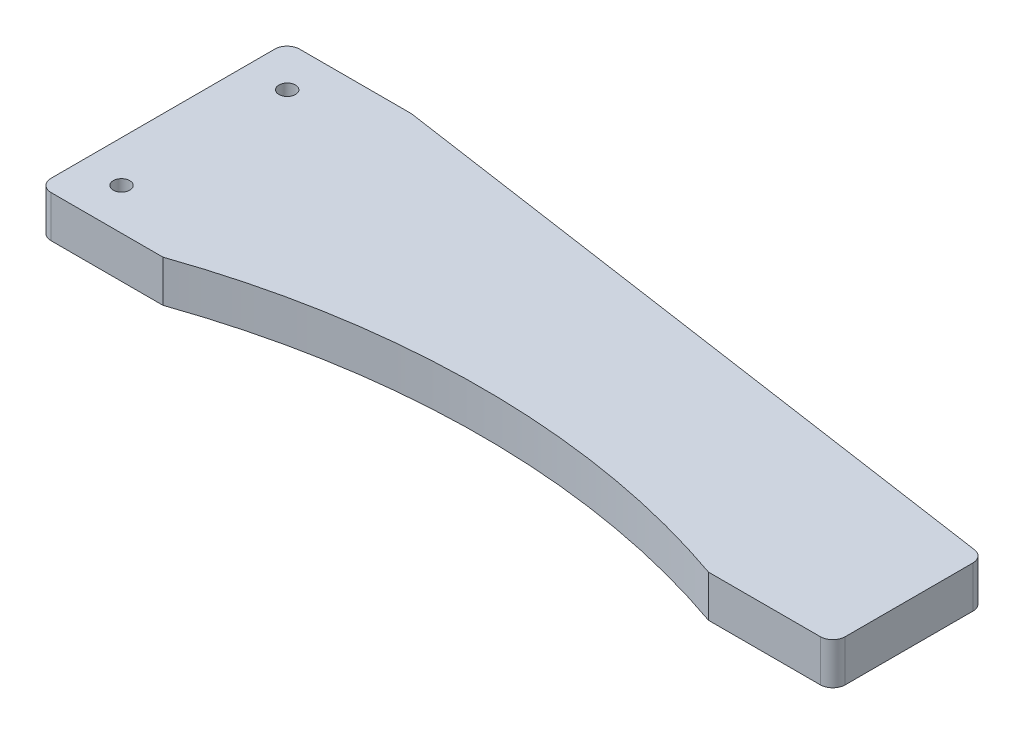
ISO-10303-21;
HEADER;
FILE_DESCRIPTION(('STEP AP214'),'2;1');
FILE_NAME('part.step','',(''),(''),'','','');
FILE_SCHEMA(('AUTOMOTIVE_DESIGN { 1 0 10303 214 1 1 1 1 }'));
ENDSEC;
DATA;
#1=APPLICATION_CONTEXT('core data for automotive mechanical design processes');
#2=APPLICATION_PROTOCOL_DEFINITION('international standard','automotive_design',2000,#1);
#3=PRODUCT_CONTEXT('',#1,'mechanical');
#4=PRODUCT('Part','Part','',(#3));
#5=PRODUCT_RELATED_PRODUCT_CATEGORY('part','',(#4));
#6=PRODUCT_DEFINITION_FORMATION('','',#4);
#7=PRODUCT_DEFINITION_CONTEXT('part definition',#1,'design');
#8=PRODUCT_DEFINITION('design','',#6,#7);
#9=PRODUCT_DEFINITION_SHAPE('','',#8);
#10=(LENGTH_UNIT() NAMED_UNIT(*) SI_UNIT(.MILLI.,.METRE.));
#11=(NAMED_UNIT(*) PLANE_ANGLE_UNIT() SI_UNIT($,.RADIAN.));
#12=(NAMED_UNIT(*) SI_UNIT($,.STERADIAN.) SOLID_ANGLE_UNIT());
#13=UNCERTAINTY_MEASURE_WITH_UNIT(LENGTH_MEASURE(1.E-05),#10,'distance_accuracy_value','');
#14=(GEOMETRIC_REPRESENTATION_CONTEXT(3) GLOBAL_UNCERTAINTY_ASSIGNED_CONTEXT((#13)) GLOBAL_UNIT_ASSIGNED_CONTEXT((#10,
#11,#12)) REPRESENTATION_CONTEXT('',''));
#15=CARTESIAN_POINT('',(0.,0.,0.));
#16=DIRECTION('',(0.,0.,1.));
#17=DIRECTION('',(1.,0.,0.));
#18=AXIS2_PLACEMENT_3D('',#15,#16,#17);
#19=CARTESIAN_POINT('',(0.396442801976787,6.4008,-2.71938751972178));
#20=DIRECTION('',(-0.144258953874828,0.,0.989539971010237));
#21=DIRECTION('',(0.989539971010237,0.,0.144258953874828));
#22=AXIS2_PLACEMENT_3D('',#19,#20,#21);
#23=PLANE('',#22);
#24=DIRECTION('',(-0.989539971010237,0.,-0.144258953874828));
#25=VECTOR('',#24,1.);
#26=CARTESIAN_POINT('',(0.396442801976787,0.,-2.71938751972178));
#27=LINE('',#26,#25);
#28=CARTESIAN_POINT('',(120.124760829426,0.,14.7350685041206));
#29=VERTEX_POINT('',#28);
#30=CARTESIAN_POINT('',(19.1866842365243,0.,0.0199263552255022));
#31=VERTEX_POINT('',#30);
#32=EDGE_CURVE('E160',#29,#31,#27,.T.);
#33=ORIENTED_EDGE('',*,*,#32,.T.);
#34=DIRECTION('',(0.,-1.,0.));
#35=VECTOR('',#34,1.);
#36=CARTESIAN_POINT('',(19.1866842365243,6.4008,0.0199263552255022));
#37=LINE('',#36,#35);
#38=CARTESIAN_POINT('',(19.1866842365243,6.4008,0.0199263552255022));
#39=VERTEX_POINT('',#38);
#40=EDGE_CURVE('E11',#39,#31,#37,.T.);
#41=ORIENTED_EDGE('',*,*,#40,.F.);
#42=DIRECTION('',(-0.989539971010237,0.,-0.144258953874828));
#43=VECTOR('',#42,1.);
#44=CARTESIAN_POINT('',(0.396442801976787,6.4008,-2.71938751972178));
#45=LINE('',#44,#43);
#46=CARTESIAN_POINT('',(120.124760829426,6.4008,14.7350685041206));
#47=VERTEX_POINT('',#46);
#48=EDGE_CURVE('E396',#47,#39,#45,.T.);
#49=ORIENTED_EDGE('',*,*,#48,.F.);
#50=DIRECTION('',(0.,-1.,0.));
#51=VECTOR('',#50,1.);
#52=CARTESIAN_POINT('',(120.124760829426,6.4008,14.7350685041206));
#53=LINE('',#52,#51);
#54=EDGE_CURVE('E150',#47,#29,#53,.T.);
#55=ORIENTED_EDGE('',*,*,#54,.T.);
#56=EDGE_LOOP('',(#33,#41,#49,#55));
#57=FACE_BOUND('',#56,.T.);
#58=ADVANCED_FACE('F32',(#57),#23,.F.);
#59=CARTESIAN_POINT('',(18.9118709293928,6.4008,1.90499999999999));
#60=DIRECTION('',(0.,-1.,0.));
#61=DIRECTION('',(0.,0.,-1.));
#62=AXIS2_PLACEMENT_3D('',#59,#60,#61);
#63=CYLINDRICAL_SURFACE('',#62,1.90499999999999);
#64=CARTESIAN_POINT('',(18.9118709293928,0.,1.90499999999999));
#65=DIRECTION('',(0.,1.,0.));
#66=DIRECTION('',(0.,0.,1.));
#67=AXIS2_PLACEMENT_3D('',#64,#65,#66);
#68=CIRCLE('',#67,1.90499999999999);
#69=CARTESIAN_POINT('',(18.9118709293928,0.,0.));
#70=VERTEX_POINT('',#69);
#71=EDGE_CURVE('E163',#31,#70,#68,.T.);
#72=ORIENTED_EDGE('',*,*,#71,.T.);
#73=DIRECTION('',(0.,-1.,0.));
#74=VECTOR('',#73,1.);
#75=CARTESIAN_POINT('',(18.9118709293928,6.4008,0.));
#76=LINE('',#75,#74);
#77=CARTESIAN_POINT('',(18.9118709293928,6.4008,0.));
#78=VERTEX_POINT('',#77);
#79=EDGE_CURVE('E41',#78,#70,#76,.T.);
#80=ORIENTED_EDGE('',*,*,#79,.F.);
#81=CARTESIAN_POINT('',(18.9118709293928,6.4008,1.90499999999999));
#82=DIRECTION('',(0.,1.,0.));
#83=DIRECTION('',(0.,0.,1.));
#84=AXIS2_PLACEMENT_3D('',#81,#82,#83);
#85=CIRCLE('',#84,1.90499999999999);
#86=EDGE_CURVE('E104',#39,#78,#85,.T.);
#87=ORIENTED_EDGE('',*,*,#86,.F.);
#88=ORIENTED_EDGE('',*,*,#40,.T.);
#89=EDGE_LOOP('',(#72,#80,#87,#88));
#90=FACE_BOUND('',#89,.T.);
#91=ADVANCED_FACE('F258',(#90),#63,.T.);
#92=CARTESIAN_POINT('',(0.,6.4008,0.));
#93=DIRECTION('',(0.,0.,1.));
#94=DIRECTION('',(1.,0.,0.));
#95=AXIS2_PLACEMENT_3D('',#92,#93,#94);
#96=PLANE('',#95);
#97=DIRECTION('',(-1.,0.,0.));
#98=VECTOR('',#97,1.);
#99=CARTESIAN_POINT('',(0.,0.,0.));
#100=LINE('',#99,#98);
#101=CARTESIAN_POINT('',(1.905,0.,0.));
#102=VERTEX_POINT('',#101);
#103=EDGE_CURVE('E165',#70,#102,#100,.T.);
#104=ORIENTED_EDGE('',*,*,#103,.T.);
#105=DIRECTION('',(0.,-1.,0.));
#106=VECTOR('',#105,1.);
#107=CARTESIAN_POINT('',(1.905,6.4008,0.));
#108=LINE('',#107,#106);
#109=CARTESIAN_POINT('',(1.905,6.4008,0.));
#110=VERTEX_POINT('',#109);
#111=EDGE_CURVE('E201',#110,#102,#108,.T.);
#112=ORIENTED_EDGE('',*,*,#111,.F.);
#113=DIRECTION('',(-1.,0.,0.));
#114=VECTOR('',#113,1.);
#115=CARTESIAN_POINT('',(0.,6.4008,0.));
#116=LINE('',#115,#114);
#117=EDGE_CURVE('E209',#78,#110,#116,.T.);
#118=ORIENTED_EDGE('',*,*,#117,.F.);
#119=ORIENTED_EDGE('',*,*,#79,.T.);
#120=EDGE_LOOP('',(#104,#112,#118,#119));
#121=FACE_BOUND('',#120,.T.);
#122=ADVANCED_FACE('F207',(#121),#96,.F.);
#123=CARTESIAN_POINT('',(1.905,6.4008,1.905));
#124=DIRECTION('',(0.,-1.,0.));
#125=DIRECTION('',(0.,0.,-1.));
#126=AXIS2_PLACEMENT_3D('',#123,#124,#125);
#127=CYLINDRICAL_SURFACE('',#126,1.905);
#128=CARTESIAN_POINT('',(1.905,0.,1.905));
#129=DIRECTION('',(0.,1.,0.));
#130=DIRECTION('',(0.,0.,1.));
#131=AXIS2_PLACEMENT_3D('',#128,#129,#130);
#132=CIRCLE('',#131,1.905);
#133=CARTESIAN_POINT('',(0.,0.,1.905));
#134=VERTEX_POINT('',#133);
#135=EDGE_CURVE('E167',#102,#134,#132,.T.);
#136=ORIENTED_EDGE('',*,*,#135,.T.);
#137=DIRECTION('',(0.,-1.,0.));
#138=VECTOR('',#137,1.);
#139=CARTESIAN_POINT('',(0.,6.4008,1.905));
#140=LINE('',#139,#138);
#141=CARTESIAN_POINT('',(0.,6.4008,1.905));
#142=VERTEX_POINT('',#141);
#143=EDGE_CURVE('E198',#142,#134,#140,.T.);
#144=ORIENTED_EDGE('',*,*,#143,.F.);
#145=CARTESIAN_POINT('',(1.905,6.4008,1.905));
#146=DIRECTION('',(0.,1.,0.));
#147=DIRECTION('',(0.,0.,1.));
#148=AXIS2_PLACEMENT_3D('',#145,#146,#147);
#149=CIRCLE('',#148,1.905);
#150=EDGE_CURVE('E227',#110,#142,#149,.T.);
#151=ORIENTED_EDGE('',*,*,#150,.F.);
#152=ORIENTED_EDGE('',*,*,#111,.T.);
#153=EDGE_LOOP('',(#136,#144,#151,#152));
#154=FACE_BOUND('',#153,.T.);
#155=ADVANCED_FACE('F218',(#154),#127,.T.);
#156=CARTESIAN_POINT('',(0.,6.4008,0.));
#157=DIRECTION('',(1.,0.,0.));
#158=DIRECTION('',(0.,0.,-1.));
#159=AXIS2_PLACEMENT_3D('',#156,#157,#158);
#160=PLANE('',#159);
#161=DIRECTION('',(0.,0.,1.));
#162=VECTOR('',#161,1.);
#163=CARTESIAN_POINT('',(0.,0.,0.));
#164=LINE('',#163,#162);
#165=CARTESIAN_POINT('',(0.,0.,36.195));
#166=VERTEX_POINT('',#165);
#167=EDGE_CURVE('E169',#134,#166,#164,.T.);
#168=ORIENTED_EDGE('',*,*,#167,.T.);
#169=DIRECTION('',(0.,-1.,0.));
#170=VECTOR('',#169,1.);
#171=CARTESIAN_POINT('',(0.,6.4008,36.195));
#172=LINE('',#171,#170);
#173=CARTESIAN_POINT('',(0.,6.4008,36.195));
#174=VERTEX_POINT('',#173);
#175=EDGE_CURVE('E195',#174,#166,#172,.T.);
#176=ORIENTED_EDGE('',*,*,#175,.F.);
#177=DIRECTION('',(0.,0.,1.));
#178=VECTOR('',#177,1.);
#179=CARTESIAN_POINT('',(0.,6.4008,0.));
#180=LINE('',#179,#178);
#181=EDGE_CURVE('E224',#142,#174,#180,.T.);
#182=ORIENTED_EDGE('',*,*,#181,.F.);
#183=ORIENTED_EDGE('',*,*,#143,.T.);
#184=EDGE_LOOP('',(#168,#176,#182,#183));
#185=FACE_BOUND('',#184,.T.);
#186=ADVANCED_FACE('F222',(#185),#160,.F.);
#187=CARTESIAN_POINT('',(1.905,6.4008,36.195));
#188=DIRECTION('',(0.,-1.,0.));
#189=DIRECTION('',(0.,0.,-1.));
#190=AXIS2_PLACEMENT_3D('',#187,#188,#189);
#191=CYLINDRICAL_SURFACE('',#190,1.905);
#192=CARTESIAN_POINT('',(1.905,0.,36.195));
#193=DIRECTION('',(0.,1.,0.));
#194=DIRECTION('',(0.,0.,1.));
#195=AXIS2_PLACEMENT_3D('',#192,#193,#194);
#196=CIRCLE('',#195,1.905);
#197=CARTESIAN_POINT('',(1.905,0.,38.1));
#198=VERTEX_POINT('',#197);
#199=EDGE_CURVE('E171',#166,#198,#196,.T.);
#200=ORIENTED_EDGE('',*,*,#199,.T.);
#201=DIRECTION('',(0.,-1.,0.));
#202=VECTOR('',#201,1.);
#203=CARTESIAN_POINT('',(1.905,6.4008,38.1));
#204=LINE('',#203,#202);
#205=CARTESIAN_POINT('',(1.905,6.4008,38.1));
#206=VERTEX_POINT('',#205);
#207=EDGE_CURVE('E192',#206,#198,#204,.T.);
#208=ORIENTED_EDGE('',*,*,#207,.F.);
#209=CARTESIAN_POINT('',(1.905,6.4008,36.195));
#210=DIRECTION('',(0.,1.,0.));
#211=DIRECTION('',(0.,0.,1.));
#212=AXIS2_PLACEMENT_3D('',#209,#210,#211);
#213=CIRCLE('',#212,1.905);
#214=EDGE_CURVE('E226',#174,#206,#213,.T.);
#215=ORIENTED_EDGE('',*,*,#214,.F.);
#216=ORIENTED_EDGE('',*,*,#175,.T.);
#217=EDGE_LOOP('',(#200,#208,#215,#216));
#218=FACE_BOUND('',#217,.T.);
#219=ADVANCED_FACE('F343',(#218),#191,.T.);
#220=CARTESIAN_POINT('',(0.,6.4008,38.1));
#221=DIRECTION('',(0.,0.,-1.));
#222=DIRECTION('',(-1.,0.,0.));
#223=AXIS2_PLACEMENT_3D('',#220,#221,#222);
#224=PLANE('',#223);
#225=DIRECTION('',(1.,0.,0.));
#226=VECTOR('',#225,1.);
#227=CARTESIAN_POINT('',(0.,0.,38.1));
#228=LINE('',#227,#226);
#229=CARTESIAN_POINT('',(19.05,0.,38.1));
#230=VERTEX_POINT('',#229);
#231=EDGE_CURVE('E173',#198,#230,#228,.T.);
#232=ORIENTED_EDGE('',*,*,#231,.T.);
#233=DIRECTION('',(0.,-1.,0.));
#234=VECTOR('',#233,1.);
#235=CARTESIAN_POINT('',(19.05,6.4008,38.1));
#236=LINE('',#235,#234);
#237=CARTESIAN_POINT('',(19.05,6.4008,38.1));
#238=VERTEX_POINT('',#237);
#239=EDGE_CURVE('E190',#238,#230,#236,.T.);
#240=ORIENTED_EDGE('',*,*,#239,.F.);
#241=DIRECTION('',(1.,0.,0.));
#242=VECTOR('',#241,1.);
#243=CARTESIAN_POINT('',(0.,6.4008,38.1));
#244=LINE('',#243,#242);
#245=EDGE_CURVE('E229',#206,#238,#244,.T.);
#246=ORIENTED_EDGE('',*,*,#245,.F.);
#247=ORIENTED_EDGE('',*,*,#207,.T.);
#248=EDGE_LOOP('',(#232,#240,#246,#247));
#249=FACE_BOUND('',#248,.T.);
#250=ADVANCED_FACE('F244',(#249),#224,.F.);
#251=CARTESIAN_POINT('',(60.8774737611471,6.4008,158.014396294859));
#252=DIRECTION('',(0.,-1.,0.));
#253=DIRECTION('',(0.,0.,-1.));
#254=AXIS2_PLACEMENT_3D('',#251,#252,#253);
#255=CYLINDRICAL_SURFACE('',#254,127.);
#256=CARTESIAN_POINT('',(60.8774737611471,0.,158.014396294859));
#257=DIRECTION('',(0.,1.,0.));
#258=DIRECTION('',(0.,0.,1.));
#259=AXIS2_PLACEMENT_3D('',#256,#257,#258);
#260=CIRCLE('',#259,127.);
#261=CARTESIAN_POINT('',(102.704947522294,0.,38.1));
#262=VERTEX_POINT('',#261);
#263=EDGE_CURVE('E176',#262,#230,#260,.T.);
#264=ORIENTED_EDGE('',*,*,#263,.F.);
#265=DIRECTION('',(0.,-1.,0.));
#266=VECTOR('',#265,1.);
#267=CARTESIAN_POINT('',(102.704947522294,6.4008,38.1));
#268=LINE('',#267,#266);
#269=CARTESIAN_POINT('',(102.704947522294,6.4008,38.1));
#270=VERTEX_POINT('',#269);
#271=EDGE_CURVE('E188',#270,#262,#268,.T.);
#272=ORIENTED_EDGE('',*,*,#271,.F.);
#273=CARTESIAN_POINT('',(60.8774737611471,6.4008,158.014396294859));
#274=DIRECTION('',(0.,1.,0.));
#275=DIRECTION('',(0.,0.,1.));
#276=AXIS2_PLACEMENT_3D('',#273,#274,#275);
#277=CIRCLE('',#276,127.);
#278=EDGE_CURVE('E235',#270,#238,#277,.T.);
#279=ORIENTED_EDGE('',*,*,#278,.T.);
#280=ORIENTED_EDGE('',*,*,#239,.T.);
#281=EDGE_LOOP('',(#264,#272,#279,#280));
#282=FACE_BOUND('',#281,.T.);
#283=ADVANCED_FACE('F239',(#282),#255,.F.);
#284=CARTESIAN_POINT('',(0.,6.4008,38.1));
#285=DIRECTION('',(0.,0.,-1.));
#286=DIRECTION('',(-1.,0.,0.));
#287=AXIS2_PLACEMENT_3D('',#284,#285,#286);
#288=PLANE('',#287);
#289=DIRECTION('',(1.,0.,0.));
#290=VECTOR('',#289,1.);
#291=CARTESIAN_POINT('',(0.,0.,38.1));
#292=LINE('',#291,#290);
#293=CARTESIAN_POINT('',(119.849947522294,0.,38.1));
#294=VERTEX_POINT('',#293);
#295=EDGE_CURVE('E179',#262,#294,#292,.T.);
#296=ORIENTED_EDGE('',*,*,#295,.T.);
#297=DIRECTION('',(0.,-1.,0.));
#298=VECTOR('',#297,1.);
#299=CARTESIAN_POINT('',(119.849947522294,6.4008,38.1));
#300=LINE('',#299,#298);
#301=CARTESIAN_POINT('',(119.849947522294,6.4008,38.1));
#302=VERTEX_POINT('',#301);
#303=EDGE_CURVE('E145',#302,#294,#300,.T.);
#304=ORIENTED_EDGE('',*,*,#303,.F.);
#305=DIRECTION('',(1.,0.,0.));
#306=VECTOR('',#305,1.);
#307=CARTESIAN_POINT('',(0.,6.4008,38.1));
#308=LINE('',#307,#306);
#309=EDGE_CURVE('E136',#270,#302,#308,.T.);
#310=ORIENTED_EDGE('',*,*,#309,.F.);
#311=ORIENTED_EDGE('',*,*,#271,.T.);
#312=EDGE_LOOP('',(#296,#304,#310,#311));
#313=FACE_BOUND('',#312,.T.);
#314=ADVANCED_FACE('F248',(#313),#288,.F.);
#315=CARTESIAN_POINT('',(119.849947522294,6.4008,36.195));
#316=DIRECTION('',(0.,-1.,0.));
#317=DIRECTION('',(0.,0.,-1.));
#318=AXIS2_PLACEMENT_3D('',#315,#316,#317);
#319=CYLINDRICAL_SURFACE('',#318,1.905);
#320=CARTESIAN_POINT('',(119.849947522294,0.,36.195));
#321=DIRECTION('',(0.,1.,0.));
#322=DIRECTION('',(0.,0.,1.));
#323=AXIS2_PLACEMENT_3D('',#320,#321,#322);
#324=CIRCLE('',#323,1.905);
#325=CARTESIAN_POINT('',(121.754947522294,0.,36.195));
#326=VERTEX_POINT('',#325);
#327=EDGE_CURVE('E144',#294,#326,#324,.T.);
#328=ORIENTED_EDGE('',*,*,#327,.T.);
#329=DIRECTION('',(0.,-1.,0.));
#330=VECTOR('',#329,1.);
#331=CARTESIAN_POINT('',(121.754947522294,6.4008,36.195));
#332=LINE('',#331,#330);
#333=CARTESIAN_POINT('',(121.754947522294,6.4008,36.195));
#334=VERTEX_POINT('',#333);
#335=EDGE_CURVE('E141',#334,#326,#332,.T.);
#336=ORIENTED_EDGE('',*,*,#335,.F.);
#337=CARTESIAN_POINT('',(119.849947522294,6.4008,36.195));
#338=DIRECTION('',(0.,1.,0.));
#339=DIRECTION('',(0.,0.,1.));
#340=AXIS2_PLACEMENT_3D('',#337,#338,#339);
#341=CIRCLE('',#340,1.905);
#342=EDGE_CURVE('E129',#302,#334,#341,.T.);
#343=ORIENTED_EDGE('',*,*,#342,.F.);
#344=ORIENTED_EDGE('',*,*,#303,.T.);
#345=EDGE_LOOP('',(#328,#336,#343,#344));
#346=FACE_BOUND('',#345,.T.);
#347=ADVANCED_FACE('F142',(#346),#319,.T.);
#348=CARTESIAN_POINT('',(121.754947522294,6.4008,0.));
#349=DIRECTION('',(-1.,0.,0.));
#350=DIRECTION('',(0.,0.,1.));
#351=AXIS2_PLACEMENT_3D('',#348,#349,#350);
#352=PLANE('',#351);
#353=DIRECTION('',(0.,0.,-1.));
#354=VECTOR('',#353,1.);
#355=CARTESIAN_POINT('',(121.754947522294,0.,0.));
#356=LINE('',#355,#354);
#357=CARTESIAN_POINT('',(121.754947522294,0.,16.6201421488951));
#358=VERTEX_POINT('',#357);
#359=EDGE_CURVE('E90',#326,#358,#356,.T.);
#360=ORIENTED_EDGE('',*,*,#359,.T.);
#361=DIRECTION('',(0.,-1.,0.));
#362=VECTOR('',#361,1.);
#363=CARTESIAN_POINT('',(121.754947522294,6.4008,16.6201421488951));
#364=LINE('',#363,#362);
#365=CARTESIAN_POINT('',(121.754947522294,6.4008,16.6201421488951));
#366=VERTEX_POINT('',#365);
#367=EDGE_CURVE('E146',#366,#358,#364,.T.);
#368=ORIENTED_EDGE('',*,*,#367,.F.);
#369=DIRECTION('',(0.,0.,-1.));
#370=VECTOR('',#369,1.);
#371=CARTESIAN_POINT('',(121.754947522294,6.4008,0.));
#372=LINE('',#371,#370);
#373=EDGE_CURVE('E133',#334,#366,#372,.T.);
#374=ORIENTED_EDGE('',*,*,#373,.F.);
#375=ORIENTED_EDGE('',*,*,#335,.T.);
#376=EDGE_LOOP('',(#360,#368,#374,#375));
#377=FACE_BOUND('',#376,.T.);
#378=ADVANCED_FACE('F148',(#377),#352,.F.);
#379=CARTESIAN_POINT('',(6.35,6.4008,31.75));
#380=DIRECTION('',(0.,-1.,0.));
#381=DIRECTION('',(0.,0.,-1.));
#382=AXIS2_PLACEMENT_3D('',#379,#380,#381);
#383=CYLINDRICAL_SURFACE('',#382,1.27);
#384=CARTESIAN_POINT('',(6.35,6.4008,31.75));
#385=DIRECTION('',(0.,1.,0.));
#386=DIRECTION('',(0.,0.,1.));
#387=AXIS2_PLACEMENT_3D('',#384,#385,#386);
#388=CIRCLE('',#387,1.27);
#389=CARTESIAN_POINT('',(6.35,6.4008,33.02));
#390=VERTEX_POINT('',#389);
#391=EDGE_CURVE('E279',#390,#390,#388,.T.);
#392=ORIENTED_EDGE('',*,*,#391,.T.);
#393=EDGE_LOOP('',(#392));
#394=FACE_BOUND('',#393,.T.);
#395=CARTESIAN_POINT('',(6.35,0.,31.75));
#396=DIRECTION('',(0.,1.,0.));
#397=DIRECTION('',(0.,0.,1.));
#398=AXIS2_PLACEMENT_3D('',#395,#396,#397);
#399=CIRCLE('',#398,1.27);
#400=CARTESIAN_POINT('',(6.35,0.,33.02));
#401=VERTEX_POINT('',#400);
#402=EDGE_CURVE('E157',#401,#401,#399,.T.);
#403=ORIENTED_EDGE('',*,*,#402,.F.);
#404=EDGE_LOOP('',(#403));
#405=FACE_BOUND('',#404,.T.);
#406=ADVANCED_FACE('F266',(#394,#405),#383,.F.);
#407=CARTESIAN_POINT('',(6.35,6.4008,6.35));
#408=DIRECTION('',(0.,-1.,0.));
#409=DIRECTION('',(0.,0.,-1.));
#410=AXIS2_PLACEMENT_3D('',#407,#408,#409);
#411=CYLINDRICAL_SURFACE('',#410,1.27);
#412=CARTESIAN_POINT('',(6.35,6.4008,6.35));
#413=DIRECTION('',(0.,1.,0.));
#414=DIRECTION('',(0.,0.,1.));
#415=AXIS2_PLACEMENT_3D('',#412,#413,#414);
#416=CIRCLE('',#415,1.27);
#417=CARTESIAN_POINT('',(6.35,6.4008,7.62));
#418=VERTEX_POINT('',#417);
#419=EDGE_CURVE('E184',#418,#418,#416,.T.);
#420=ORIENTED_EDGE('',*,*,#419,.T.);
#421=EDGE_LOOP('',(#420));
#422=FACE_BOUND('',#421,.T.);
#423=CARTESIAN_POINT('',(6.35,0.,6.35));
#424=DIRECTION('',(0.,1.,0.));
#425=DIRECTION('',(0.,0.,1.));
#426=AXIS2_PLACEMENT_3D('',#423,#424,#425);
#427=CIRCLE('',#426,1.27);
#428=CARTESIAN_POINT('',(6.35,0.,7.62));
#429=VERTEX_POINT('',#428);
#430=EDGE_CURVE('E154',#429,#429,#427,.T.);
#431=ORIENTED_EDGE('',*,*,#430,.F.);
#432=EDGE_LOOP('',(#431));
#433=FACE_BOUND('',#432,.T.);
#434=ADVANCED_FACE('F34',(#422,#433),#411,.F.);
#435=CARTESIAN_POINT('',(119.849947522294,6.4008,16.6201421488951));
#436=DIRECTION('',(0.,-1.,0.));
#437=DIRECTION('',(0.,0.,-1.));
#438=AXIS2_PLACEMENT_3D('',#435,#436,#437);
#439=CYLINDRICAL_SURFACE('',#438,1.905);
#440=CARTESIAN_POINT('',(119.849947522294,0.,16.6201421488951));
#441=DIRECTION('',(0.,1.,0.));
#442=DIRECTION('',(0.,0.,1.));
#443=AXIS2_PLACEMENT_3D('',#440,#441,#442);
#444=CIRCLE('',#443,1.905);
#445=EDGE_CURVE('E96',#358,#29,#444,.T.);
#446=ORIENTED_EDGE('',*,*,#445,.T.);
#447=ORIENTED_EDGE('',*,*,#54,.F.);
#448=CARTESIAN_POINT('',(119.849947522294,6.4008,16.6201421488951));
#449=DIRECTION('',(0.,1.,0.));
#450=DIRECTION('',(0.,0.,1.));
#451=AXIS2_PLACEMENT_3D('',#448,#449,#450);
#452=CIRCLE('',#451,1.905);
#453=EDGE_CURVE('E49',#366,#47,#452,.T.);
#454=ORIENTED_EDGE('',*,*,#453,.F.);
#455=ORIENTED_EDGE('',*,*,#367,.T.);
#456=EDGE_LOOP('',(#446,#447,#454,#455));
#457=FACE_BOUND('',#456,.T.);
#458=ADVANCED_FACE('F273',(#457),#439,.T.);
#459=CARTESIAN_POINT('',(0.,6.4008,0.));
#460=DIRECTION('',(0.,1.,0.));
#461=DIRECTION('',(0.,0.,1.));
#462=AXIS2_PLACEMENT_3D('',#459,#460,#461);
#463=PLANE('',#462);
#464=ORIENTED_EDGE('',*,*,#419,.F.);
#465=EDGE_LOOP('',(#464));
#466=FACE_BOUND('',#465,.T.);
#467=ORIENTED_EDGE('',*,*,#391,.F.);
#468=EDGE_LOOP('',(#467));
#469=FACE_BOUND('',#468,.T.);
#470=ORIENTED_EDGE('',*,*,#48,.T.);
#471=ORIENTED_EDGE('',*,*,#86,.T.);
#472=ORIENTED_EDGE('',*,*,#117,.T.);
#473=ORIENTED_EDGE('',*,*,#150,.T.);
#474=ORIENTED_EDGE('',*,*,#181,.T.);
#475=ORIENTED_EDGE('',*,*,#214,.T.);
#476=ORIENTED_EDGE('',*,*,#245,.T.);
#477=ORIENTED_EDGE('',*,*,#278,.F.);
#478=ORIENTED_EDGE('',*,*,#309,.T.);
#479=ORIENTED_EDGE('',*,*,#342,.T.);
#480=ORIENTED_EDGE('',*,*,#373,.T.);
#481=ORIENTED_EDGE('',*,*,#453,.T.);
#482=EDGE_LOOP('',(#470,#471,#472,#473,#474,#475,#476,#477,#478,#479,#480,#481));
#483=FACE_BOUND('',#482,.T.);
#484=ADVANCED_FACE('F131',(#466,#469,#483),#463,.T.);
#485=CARTESIAN_POINT('',(0.,0.,0.));
#486=DIRECTION('',(0.,1.,0.));
#487=DIRECTION('',(0.,0.,1.));
#488=AXIS2_PLACEMENT_3D('',#485,#486,#487);
#489=PLANE('',#488);
#490=ORIENTED_EDGE('',*,*,#430,.T.);
#491=EDGE_LOOP('',(#490));
#492=FACE_BOUND('',#491,.T.);
#493=ORIENTED_EDGE('',*,*,#402,.T.);
#494=EDGE_LOOP('',(#493));
#495=FACE_BOUND('',#494,.T.);
#496=ORIENTED_EDGE('',*,*,#32,.F.);
#497=ORIENTED_EDGE('',*,*,#445,.F.);
#498=ORIENTED_EDGE('',*,*,#359,.F.);
#499=ORIENTED_EDGE('',*,*,#327,.F.);
#500=ORIENTED_EDGE('',*,*,#295,.F.);
#501=ORIENTED_EDGE('',*,*,#263,.T.);
#502=ORIENTED_EDGE('',*,*,#231,.F.);
#503=ORIENTED_EDGE('',*,*,#199,.F.);
#504=ORIENTED_EDGE('',*,*,#167,.F.);
#505=ORIENTED_EDGE('',*,*,#135,.F.);
#506=ORIENTED_EDGE('',*,*,#103,.F.);
#507=ORIENTED_EDGE('',*,*,#71,.F.);
#508=EDGE_LOOP('',(#496,#497,#498,#499,#500,#501,#502,#503,#504,#505,#506,#507));
#509=FACE_BOUND('',#508,.T.);
#510=ADVANCED_FACE('F213',(#492,#495,#509),#489,.F.);
#511=CLOSED_SHELL('',(#58,#91,#122,#155,#186,#219,#250,#283,#314,#347,#378,#406,#434,#458,#484,#510));
#512=MANIFOLD_SOLID_BREP('B2',#511);
#513=ADVANCED_BREP_SHAPE_REPRESENTATION('',(#18,#512),#14);
#514=SHAPE_DEFINITION_REPRESENTATION(#9,#513);
ENDSEC;
END-ISO-10303-21;
